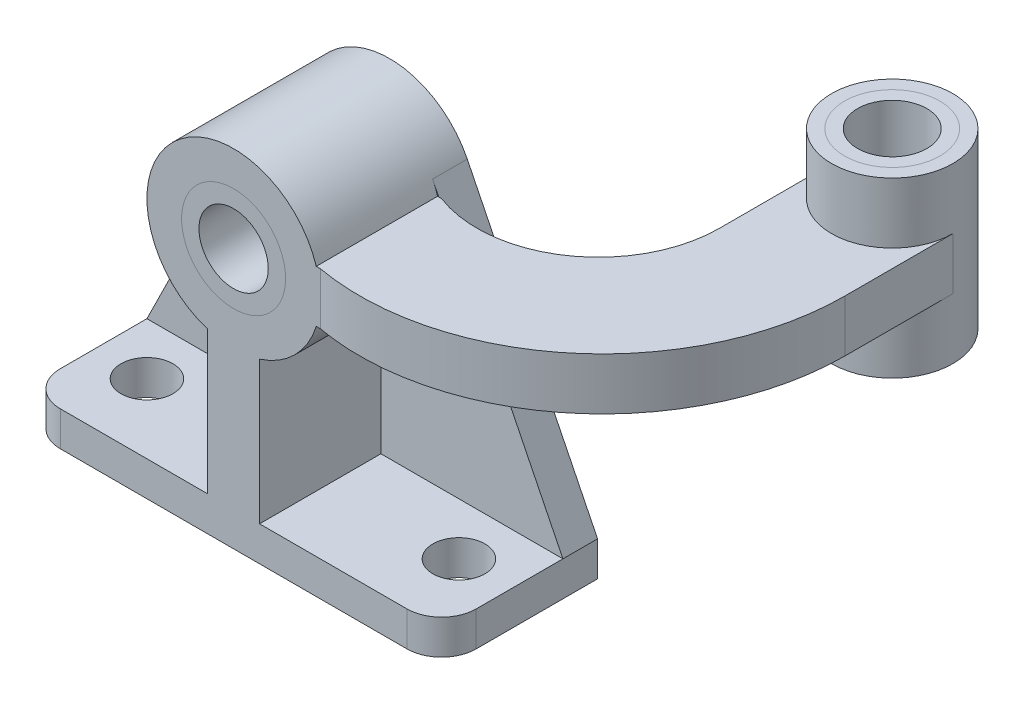
ISO-10303-21;
HEADER;
FILE_DESCRIPTION(('STEP AP214'),'2;1');
FILE_NAME('part.step','',(''),(''),'','','');
FILE_SCHEMA(('AUTOMOTIVE_DESIGN { 1 0 10303 214 1 1 1 1 }'));
ENDSEC;
DATA;
#1=APPLICATION_CONTEXT('core data for automotive mechanical design processes');
#2=APPLICATION_PROTOCOL_DEFINITION('international standard','automotive_design',2000,#1);
#3=PRODUCT_CONTEXT('',#1,'mechanical');
#4=PRODUCT('Part','Part','',(#3));
#5=PRODUCT_RELATED_PRODUCT_CATEGORY('part','',(#4));
#6=PRODUCT_DEFINITION_FORMATION('','',#4);
#7=PRODUCT_DEFINITION_CONTEXT('part definition',#1,'design');
#8=PRODUCT_DEFINITION('design','',#6,#7);
#9=PRODUCT_DEFINITION_SHAPE('','',#8);
#10=(LENGTH_UNIT() NAMED_UNIT(*) SI_UNIT(.MILLI.,.METRE.));
#11=(NAMED_UNIT(*) PLANE_ANGLE_UNIT() SI_UNIT($,.RADIAN.));
#12=(NAMED_UNIT(*) SI_UNIT($,.STERADIAN.) SOLID_ANGLE_UNIT());
#13=UNCERTAINTY_MEASURE_WITH_UNIT(LENGTH_MEASURE(1.E-05),#10,'distance_accuracy_value','');
#14=(GEOMETRIC_REPRESENTATION_CONTEXT(3) GLOBAL_UNCERTAINTY_ASSIGNED_CONTEXT((#13)) GLOBAL_UNIT_ASSIGNED_CONTEXT((#10,
#11,#12)) REPRESENTATION_CONTEXT('',''));
#15=CARTESIAN_POINT('',(0.,0.,0.));
#16=DIRECTION('',(0.,0.,1.));
#17=DIRECTION('',(1.,0.,0.));
#18=AXIS2_PLACEMENT_3D('',#15,#16,#17);
#19=CARTESIAN_POINT('',(18.,5.,-11.));
#20=DIRECTION('',(0.,-1.,0.));
#21=DIRECTION('',(0.,0.,-1.));
#22=AXIS2_PLACEMENT_3D('',#19,#20,#21);
#23=CYLINDRICAL_SURFACE('',#22,2.);
#24=CARTESIAN_POINT('',(18.,5.,-11.));
#25=DIRECTION('',(0.,1.,0.));
#26=DIRECTION('',(0.,0.,1.));
#27=AXIS2_PLACEMENT_3D('',#24,#25,#26);
#28=CIRCLE('',#27,2.);
#29=CARTESIAN_POINT('',(18.,5.,-9.));
#30=VERTEX_POINT('',#29);
#31=EDGE_CURVE('E61',#30,#30,#28,.T.);
#32=ORIENTED_EDGE('',*,*,#31,.T.);
#33=EDGE_LOOP('',(#32));
#34=FACE_BOUND('',#33,.T.);
#35=CARTESIAN_POINT('',(18.,-5.,-11.));
#36=DIRECTION('',(0.,1.,0.));
#37=DIRECTION('',(0.,0.,1.));
#38=AXIS2_PLACEMENT_3D('',#35,#36,#37);
#39=CIRCLE('',#38,2.);
#40=CARTESIAN_POINT('',(18.,-5.,-9.));
#41=VERTEX_POINT('',#40);
#42=EDGE_CURVE('E67',#41,#41,#39,.T.);
#43=ORIENTED_EDGE('',*,*,#42,.F.);
#44=EDGE_LOOP('',(#43));
#45=FACE_BOUND('',#44,.T.);
#46=ADVANCED_FACE('F54',(#34,#45),#23,.F.);
#47=CARTESIAN_POINT('',(18.,5.,-11.));
#48=DIRECTION('',(0.,-1.,0.));
#49=DIRECTION('',(0.,0.,-1.));
#50=AXIS2_PLACEMENT_3D('',#47,#48,#49);
#51=CYLINDRICAL_SURFACE('',#50,2.75);
#52=CARTESIAN_POINT('',(18.,5.,-11.));
#53=DIRECTION('',(0.,1.,0.));
#54=DIRECTION('',(0.,0.,1.));
#55=AXIS2_PLACEMENT_3D('',#52,#53,#54);
#56=CIRCLE('',#55,2.75);
#57=CARTESIAN_POINT('',(18.,5.,-8.25));
#58=VERTEX_POINT('',#57);
#59=EDGE_CURVE('E11',#58,#58,#56,.T.);
#60=ORIENTED_EDGE('',*,*,#59,.F.);
#61=EDGE_LOOP('',(#60));
#62=FACE_BOUND('',#61,.T.);
#63=CARTESIAN_POINT('',(18.,-5.,-11.));
#64=DIRECTION('',(0.,1.,0.));
#65=DIRECTION('',(0.,0.,1.));
#66=AXIS2_PLACEMENT_3D('',#63,#64,#65);
#67=CIRCLE('',#66,2.75);
#68=CARTESIAN_POINT('',(18.,-5.,-8.25));
#69=VERTEX_POINT('',#68);
#70=EDGE_CURVE('E57',#69,#69,#67,.T.);
#71=ORIENTED_EDGE('',*,*,#70,.T.);
#72=EDGE_LOOP('',(#71));
#73=FACE_BOUND('',#72,.T.);
#74=ADVANCED_FACE('F74',(#62,#73),#51,.T.);
#75=CARTESIAN_POINT('',(0.,5.,0.));
#76=DIRECTION('',(0.,1.,0.));
#77=DIRECTION('',(0.,0.,1.));
#78=AXIS2_PLACEMENT_3D('',#75,#76,#77);
#79=PLANE('',#78);
#80=ORIENTED_EDGE('',*,*,#31,.F.);
#81=EDGE_LOOP('',(#80));
#82=FACE_BOUND('',#81,.T.);
#83=ORIENTED_EDGE('',*,*,#59,.T.);
#84=EDGE_LOOP('',(#83));
#85=FACE_BOUND('',#84,.T.);
#86=ADVANCED_FACE('F78',(#82,#85),#79,.T.);
#87=CARTESIAN_POINT('',(0.,-5.,0.));
#88=DIRECTION('',(0.,1.,0.));
#89=DIRECTION('',(0.,0.,1.));
#90=AXIS2_PLACEMENT_3D('',#87,#88,#89);
#91=PLANE('',#90);
#92=ORIENTED_EDGE('',*,*,#42,.T.);
#93=EDGE_LOOP('',(#92));
#94=FACE_BOUND('',#93,.T.);
#95=ORIENTED_EDGE('',*,*,#70,.F.);
#96=EDGE_LOOP('',(#95));
#97=FACE_BOUND('',#96,.T.);
#98=ADVANCED_FACE('F76',(#94,#97),#91,.F.);
#99=CLOSED_SHELL('',(#46,#74,#86,#98));
#100=MANIFOLD_SOLID_BREP('B2',#99);
#101=CARTESIAN_POINT('',(0.,0.,9.));
#102=DIRECTION('',(0.,0.,-1.));
#103=DIRECTION('',(-1.,0.,0.));
#104=AXIS2_PLACEMENT_3D('',#101,#102,#103);
#105=CYLINDRICAL_SURFACE('',#104,2.);
#106=CARTESIAN_POINT('',(0.,0.,9.));
#107=DIRECTION('',(0.,0.,1.));
#108=DIRECTION('',(1.,0.,0.));
#109=AXIS2_PLACEMENT_3D('',#106,#107,#108);
#110=CIRCLE('',#109,2.);
#111=CARTESIAN_POINT('',(2.,0.,9.));
#112=VERTEX_POINT('',#111);
#113=EDGE_CURVE('E140',#112,#112,#110,.T.);
#114=ORIENTED_EDGE('',*,*,#113,.T.);
#115=EDGE_LOOP('',(#114));
#116=FACE_BOUND('',#115,.T.);
#117=CARTESIAN_POINT('',(0.,0.,0.));
#118=DIRECTION('',(0.,0.,1.));
#119=DIRECTION('',(1.,0.,0.));
#120=AXIS2_PLACEMENT_3D('',#117,#118,#119);
#121=CIRCLE('',#120,2.);
#122=CARTESIAN_POINT('',(2.,0.,0.));
#123=VERTEX_POINT('',#122);
#124=EDGE_CURVE('E146',#123,#123,#121,.T.);
#125=ORIENTED_EDGE('',*,*,#124,.F.);
#126=EDGE_LOOP('',(#125));
#127=FACE_BOUND('',#126,.T.);
#128=ADVANCED_FACE('F133',(#116,#127),#105,.F.);
#129=CARTESIAN_POINT('',(0.,0.,9.));
#130=DIRECTION('',(0.,0.,-1.));
#131=DIRECTION('',(-1.,0.,0.));
#132=AXIS2_PLACEMENT_3D('',#129,#130,#131);
#133=CYLINDRICAL_SURFACE('',#132,3.);
#134=CARTESIAN_POINT('',(0.,0.,9.));
#135=DIRECTION('',(0.,0.,1.));
#136=DIRECTION('',(1.,0.,0.));
#137=AXIS2_PLACEMENT_3D('',#134,#135,#136);
#138=CIRCLE('',#137,3.);
#139=CARTESIAN_POINT('',(3.,0.,9.));
#140=VERTEX_POINT('',#139);
#141=EDGE_CURVE('E53',#140,#140,#138,.T.);
#142=ORIENTED_EDGE('',*,*,#141,.F.);
#143=EDGE_LOOP('',(#142));
#144=FACE_BOUND('',#143,.T.);
#145=CARTESIAN_POINT('',(0.,0.,0.));
#146=DIRECTION('',(0.,0.,1.));
#147=DIRECTION('',(1.,0.,0.));
#148=AXIS2_PLACEMENT_3D('',#145,#146,#147);
#149=CIRCLE('',#148,3.);
#150=CARTESIAN_POINT('',(3.,0.,0.));
#151=VERTEX_POINT('',#150);
#152=EDGE_CURVE('E136',#151,#151,#149,.T.);
#153=ORIENTED_EDGE('',*,*,#152,.T.);
#154=EDGE_LOOP('',(#153));
#155=FACE_BOUND('',#154,.T.);
#156=ADVANCED_FACE('F153',(#144,#155),#133,.T.);
#157=CARTESIAN_POINT('',(0.,0.,9.));
#158=DIRECTION('',(0.,0.,1.));
#159=DIRECTION('',(1.,0.,0.));
#160=AXIS2_PLACEMENT_3D('',#157,#158,#159);
#161=PLANE('',#160);
#162=ORIENTED_EDGE('',*,*,#113,.F.);
#163=EDGE_LOOP('',(#162));
#164=FACE_BOUND('',#163,.T.);
#165=ORIENTED_EDGE('',*,*,#141,.T.);
#166=EDGE_LOOP('',(#165));
#167=FACE_BOUND('',#166,.T.);
#168=ADVANCED_FACE('F157',(#164,#167),#161,.T.);
#169=CARTESIAN_POINT('',(0.,0.,0.));
#170=DIRECTION('',(0.,0.,1.));
#171=DIRECTION('',(1.,0.,0.));
#172=AXIS2_PLACEMENT_3D('',#169,#170,#171);
#173=PLANE('',#172);
#174=ORIENTED_EDGE('',*,*,#124,.T.);
#175=EDGE_LOOP('',(#174));
#176=FACE_BOUND('',#175,.T.);
#177=ORIENTED_EDGE('',*,*,#152,.F.);
#178=EDGE_LOOP('',(#177));
#179=FACE_BOUND('',#178,.T.);
#180=ADVANCED_FACE('F155',(#176,#179),#173,.F.);
#181=CLOSED_SHELL('',(#128,#156,#168,#180));
#182=MANIFOLD_SOLID_BREP('B6',#181);
#183=CARTESIAN_POINT('',(0.,0.,9.));
#184=DIRECTION('',(0.,0.,-1.));
#185=DIRECTION('',(-1.,0.,0.));
#186=AXIS2_PLACEMENT_3D('',#183,#184,#185);
#187=CYLINDRICAL_SURFACE('',#186,5.);
#188=DIRECTION('',(0.,0.,-1.));
#189=VECTOR('',#188,1.);
#190=CARTESIAN_POINT('',(4.76969600708473,-1.5,9.));
#191=LINE('',#190,#189);
#192=CARTESIAN_POINT('',(4.76969600708473,-1.5,9.));
#193=VERTEX_POINT('',#192);
#194=CARTESIAN_POINT('',(4.76969600708473,-1.5,2.));
#195=VERTEX_POINT('',#194);
#196=EDGE_CURVE('E442',#193,#195,#191,.T.);
#197=ORIENTED_EDGE('',*,*,#196,.F.);
#198=CARTESIAN_POINT('',(0.,0.,9.));
#199=DIRECTION('',(0.,0.,1.));
#200=DIRECTION('',(1.,0.,0.));
#201=AXIS2_PLACEMENT_3D('',#198,#199,#200);
#202=CIRCLE('',#201,5.);
#203=CARTESIAN_POINT('',(1.5,-4.76969600708473,9.));
#204=VERTEX_POINT('',#203);
#205=EDGE_CURVE('E506',#204,#193,#202,.T.);
#206=ORIENTED_EDGE('',*,*,#205,.F.);
#207=DIRECTION('',(0.,0.,-1.));
#208=VECTOR('',#207,1.);
#209=CARTESIAN_POINT('',(1.5,-4.76969600708473,9.));
#210=LINE('',#209,#208);
#211=CARTESIAN_POINT('',(1.5,-4.76969600708473,2.));
#212=VERTEX_POINT('',#211);
#213=EDGE_CURVE('E558',#204,#212,#210,.T.);
#214=ORIENTED_EDGE('',*,*,#213,.T.);
#215=CARTESIAN_POINT('',(0.,0.,2.));
#216=DIRECTION('',(0.,0.,1.));
#217=DIRECTION('',(1.,0.,0.));
#218=AXIS2_PLACEMENT_3D('',#215,#216,#217);
#219=CIRCLE('',#218,5.);
#220=EDGE_CURVE('E567',#212,#195,#219,.T.);
#221=ORIENTED_EDGE('',*,*,#220,.T.);
#222=EDGE_LOOP('',(#197,#206,#214,#221));
#223=FACE_BOUND('',#222,.T.);
#224=ADVANCED_FACE('F209',(#223),#187,.T.);
#225=CARTESIAN_POINT('',(0.,0.,2.));
#226=DIRECTION('',(0.,0.,1.));
#227=DIRECTION('',(1.,0.,0.));
#228=AXIS2_PLACEMENT_3D('',#225,#226,#227);
#229=PLANE('',#228);
#230=DIRECTION('',(-0.442960872146089,0.896540944824929,0.));
#231=VECTOR('',#230,1.);
#232=CARTESIAN_POINT('',(4.48270472412465,2.21480436073044,2.));
#233=LINE('',#232,#231);
#234=CARTESIAN_POINT('',(12.,-13.,2.));
#235=VERTEX_POINT('',#234);
#236=CARTESIAN_POINT('',(5.,1.16781257308152,2.));
#237=VERTEX_POINT('',#236);
#238=EDGE_CURVE('E580',#235,#237,#233,.T.);
#239=ORIENTED_EDGE('',*,*,#238,.T.);
#240=DIRECTION('',(0.,-1.,0.));
#241=VECTOR('',#240,1.);
#242=CARTESIAN_POINT('',(5.,1.5,2.));
#243=LINE('',#242,#241);
#244=CARTESIAN_POINT('',(5.,-1.5,2.));
#245=VERTEX_POINT('',#244);
#246=EDGE_CURVE('E596',#237,#245,#243,.T.);
#247=ORIENTED_EDGE('',*,*,#246,.T.);
#248=DIRECTION('',(-1.,0.,0.));
#249=VECTOR('',#248,1.);
#250=CARTESIAN_POINT('',(0.,-1.5,2.));
#251=LINE('',#250,#249);
#252=EDGE_CURVE('E421',#245,#195,#251,.T.);
#253=ORIENTED_EDGE('',*,*,#252,.T.);
#254=ORIENTED_EDGE('',*,*,#220,.F.);
#255=DIRECTION('',(0.,-1.,0.));
#256=VECTOR('',#255,1.);
#257=CARTESIAN_POINT('',(1.5,0.,2.));
#258=LINE('',#257,#256);
#259=CARTESIAN_POINT('',(1.5,-13.,2.));
#260=VERTEX_POINT('',#259);
#261=EDGE_CURVE('E571',#212,#260,#258,.T.);
#262=ORIENTED_EDGE('',*,*,#261,.T.);
#263=DIRECTION('',(-1.,0.,0.));
#264=VECTOR('',#263,1.);
#265=CARTESIAN_POINT('',(0.,-13.,2.));
#266=LINE('',#265,#264);
#267=EDGE_CURVE('E576',#235,#260,#266,.T.);
#268=ORIENTED_EDGE('',*,*,#267,.F.);
#269=EDGE_LOOP('',(#239,#247,#253,#254,#262,#268));
#270=FACE_BOUND('',#269,.T.);
#271=ADVANCED_FACE('F688',(#270),#229,.T.);
#272=DIRECTION('',(-1.,0.,0.));
#273=VECTOR('',#272,1.);
#274=CARTESIAN_POINT('',(0.,1.5,2.));
#275=LINE('',#274,#273);
#276=CARTESIAN_POINT('',(4.83587360600412,1.5,2.));
#277=VERTEX_POINT('',#276);
#278=CARTESIAN_POINT('',(4.76969600708473,1.5,2.));
#279=VERTEX_POINT('',#278);
#280=EDGE_CURVE('E395',#277,#279,#275,.T.);
#281=ORIENTED_EDGE('',*,*,#280,.F.);
#282=CARTESIAN_POINT('',(4.48270472412465,2.21480436073044,2.));
#283=VERTEX_POINT('',#282);
#284=EDGE_CURVE('E579',#277,#283,#233,.T.);
#285=ORIENTED_EDGE('',*,*,#284,.T.);
#286=EDGE_CURVE('E572',#279,#283,#219,.T.);
#287=ORIENTED_EDGE('',*,*,#286,.F.);
#288=EDGE_LOOP('',(#281,#285,#287));
#289=FACE_BOUND('',#288,.T.);
#290=ADVANCED_FACE('F636',(#289),#229,.T.);
#291=CARTESIAN_POINT('',(4.76969600708473,1.5,9.));
#292=VERTEX_POINT('',#291);
#293=CARTESIAN_POINT('',(-1.5,-4.76969600708473,9.));
#294=VERTEX_POINT('',#293);
#295=EDGE_CURVE('E505',#292,#294,#202,.T.);
#296=ORIENTED_EDGE('',*,*,#295,.F.);
#297=DIRECTION('',(0.,0.,-1.));
#298=VECTOR('',#297,1.);
#299=CARTESIAN_POINT('',(4.76969600708473,1.5,9.));
#300=LINE('',#299,#298);
#301=EDGE_CURVE('E445',#292,#279,#300,.T.);
#302=ORIENTED_EDGE('',*,*,#301,.T.);
#303=ORIENTED_EDGE('',*,*,#286,.T.);
#304=DIRECTION('',(0.,0.,-1.));
#305=VECTOR('',#304,1.);
#306=CARTESIAN_POINT('',(4.48270472412465,2.21480436073044,2.));
#307=LINE('',#306,#305);
#308=CARTESIAN_POINT('',(4.48270472412465,2.21480436073044,0.));
#309=VERTEX_POINT('',#308);
#310=EDGE_CURVE('E584',#283,#309,#307,.T.);
#311=ORIENTED_EDGE('',*,*,#310,.T.);
#312=CARTESIAN_POINT('',(0.,0.,0.));
#313=DIRECTION('',(0.,0.,1.));
#314=DIRECTION('',(1.,0.,0.));
#315=AXIS2_PLACEMENT_3D('',#312,#313,#314);
#316=CIRCLE('',#315,5.);
#317=CARTESIAN_POINT('',(-4.48270472412464,2.21480436073044,0.));
#318=VERTEX_POINT('',#317);
#319=EDGE_CURVE('E525',#309,#318,#316,.T.);
#320=ORIENTED_EDGE('',*,*,#319,.T.);
#321=DIRECTION('',(0.,0.,-1.));
#322=VECTOR('',#321,1.);
#323=CARTESIAN_POINT('',(-4.48270472412464,2.21480436073044,2.));
#324=LINE('',#323,#322);
#325=CARTESIAN_POINT('',(-4.48270472412464,2.21480436073044,2.));
#326=VERTEX_POINT('',#325);
#327=EDGE_CURVE('E489',#326,#318,#324,.T.);
#328=ORIENTED_EDGE('',*,*,#327,.F.);
#329=CARTESIAN_POINT('',(0.,0.,2.));
#330=DIRECTION('',(0.,0.,1.));
#331=DIRECTION('',(1.,0.,0.));
#332=AXIS2_PLACEMENT_3D('',#329,#330,#331);
#333=CIRCLE('',#332,5.);
#334=CARTESIAN_POINT('',(-1.5,-4.76969600708473,2.));
#335=VERTEX_POINT('',#334);
#336=EDGE_CURVE('E466',#326,#335,#333,.T.);
#337=ORIENTED_EDGE('',*,*,#336,.T.);
#338=DIRECTION('',(0.,0.,-1.));
#339=VECTOR('',#338,1.);
#340=CARTESIAN_POINT('',(-1.5,-4.76969600708473,9.));
#341=LINE('',#340,#339);
#342=EDGE_CURVE('E554',#294,#335,#341,.T.);
#343=ORIENTED_EDGE('',*,*,#342,.F.);
#344=EDGE_LOOP('',(#296,#302,#303,#311,#320,#328,#337,#343));
#345=FACE_BOUND('',#344,.T.);
#346=ADVANCED_FACE('F633',(#345),#187,.T.);
#347=CARTESIAN_POINT('',(4.48270472412465,2.21480436073044,2.));
#348=DIRECTION('',(-0.896540944824929,-0.442960872146089,0.));
#349=DIRECTION('',(0.442960872146089,-0.896540944824929,0.));
#350=AXIS2_PLACEMENT_3D('',#347,#348,#349);
#351=PLANE('',#350);
#352=DIRECTION('',(-0.442960872146089,0.896540944824929,0.));
#353=VECTOR('',#352,1.);
#354=CARTESIAN_POINT('',(4.48270472412465,2.21480436073044,0.));
#355=LINE('',#354,#353);
#356=CARTESIAN_POINT('',(12.,-13.,0.));
#357=VERTEX_POINT('',#356);
#358=EDGE_CURVE('E566',#357,#309,#355,.T.);
#359=ORIENTED_EDGE('',*,*,#358,.T.);
#360=ORIENTED_EDGE('',*,*,#310,.F.);
#361=ORIENTED_EDGE('',*,*,#284,.F.);
#362=EDGE_CURVE('E585',#237,#277,#233,.T.);
#363=ORIENTED_EDGE('',*,*,#362,.F.);
#364=ORIENTED_EDGE('',*,*,#238,.F.);
#365=DIRECTION('',(0.,0.,-1.));
#366=VECTOR('',#365,1.);
#367=CARTESIAN_POINT('',(12.,-13.,2.));
#368=LINE('',#367,#366);
#369=EDGE_CURVE('E592',#235,#357,#368,.T.);
#370=ORIENTED_EDGE('',*,*,#369,.T.);
#371=EDGE_LOOP('',(#359,#360,#361,#363,#364,#370));
#372=FACE_BOUND('',#371,.T.);
#373=ADVANCED_FACE('F639',(#372),#351,.F.);
#374=CARTESIAN_POINT('',(0.,0.,0.));
#375=DIRECTION('',(0.,0.,1.));
#376=DIRECTION('',(1.,0.,0.));
#377=AXIS2_PLACEMENT_3D('',#374,#375,#376);
#378=PLANE('',#377);
#379=ORIENTED_EDGE('',*,*,#358,.F.);
#380=DIRECTION('',(0.,1.,0.));
#381=VECTOR('',#380,1.);
#382=CARTESIAN_POINT('',(12.,0.,0.));
#383=LINE('',#382,#381);
#384=CARTESIAN_POINT('',(12.,-15.,0.));
#385=VERTEX_POINT('',#384);
#386=EDGE_CURVE('E498',#385,#357,#383,.T.);
#387=ORIENTED_EDGE('',*,*,#386,.F.);
#388=DIRECTION('',(1.,0.,0.));
#389=VECTOR('',#388,1.);
#390=CARTESIAN_POINT('',(0.,-15.,0.));
#391=LINE('',#390,#389);
#392=CARTESIAN_POINT('',(-12.,-15.,0.));
#393=VERTEX_POINT('',#392);
#394=EDGE_CURVE('E533',#393,#385,#391,.T.);
#395=ORIENTED_EDGE('',*,*,#394,.F.);
#396=DIRECTION('',(0.,-1.,0.));
#397=VECTOR('',#396,1.);
#398=CARTESIAN_POINT('',(-12.,0.,0.));
#399=LINE('',#398,#397);
#400=CARTESIAN_POINT('',(-12.,-13.,0.));
#401=VERTEX_POINT('',#400);
#402=EDGE_CURVE('E529',#401,#393,#399,.T.);
#403=ORIENTED_EDGE('',*,*,#402,.F.);
#404=DIRECTION('',(0.442960872146088,0.896540944824929,0.));
#405=VECTOR('',#404,1.);
#406=CARTESIAN_POINT('',(-4.48270472412464,2.21480436073044,0.));
#407=LINE('',#406,#405);
#408=EDGE_CURVE('E459',#401,#318,#407,.T.);
#409=ORIENTED_EDGE('',*,*,#408,.T.);
#410=ORIENTED_EDGE('',*,*,#319,.F.);
#411=EDGE_LOOP('',(#379,#387,#395,#403,#409,#410));
#412=FACE_BOUND('',#411,.T.);
#413=CARTESIAN_POINT('',(0.,0.,0.));
#414=DIRECTION('',(0.,0.,1.));
#415=DIRECTION('',(1.,0.,0.));
#416=AXIS2_PLACEMENT_3D('',#413,#414,#415);
#417=CIRCLE('',#416,3.);
#418=CARTESIAN_POINT('',(3.,0.,0.));
#419=VERTEX_POINT('',#418);
#420=EDGE_CURVE('E492',#419,#419,#417,.T.);
#421=ORIENTED_EDGE('',*,*,#420,.T.);
#422=EDGE_LOOP('',(#421));
#423=FACE_BOUND('',#422,.T.);
#424=ADVANCED_FACE('F644',(#412,#423),#378,.F.);
#425=CARTESIAN_POINT('',(0.,-13.,9.));
#426=DIRECTION('',(0.,-1.,0.));
#427=DIRECTION('',(1.,0.,0.));
#428=AXIS2_PLACEMENT_3D('',#425,#426,#427);
#429=PLANE('',#428);
#430=CARTESIAN_POINT('',(9.,-13.,5.));
#431=DIRECTION('',(0.,1.,0.));
#432=DIRECTION('',(-1.,0.,0.));
#433=AXIS2_PLACEMENT_3D('',#430,#431,#432);
#434=CIRCLE('',#433,1.5);
#435=CARTESIAN_POINT('',(7.5,-13.,5.));
#436=VERTEX_POINT('',#435);
#437=EDGE_CURVE('E450',#436,#436,#434,.T.);
#438=ORIENTED_EDGE('',*,*,#437,.F.);
#439=EDGE_LOOP('',(#438));
#440=FACE_BOUND('',#439,.T.);
#441=DIRECTION('',(-1.,0.,0.));
#442=VECTOR('',#441,1.);
#443=CARTESIAN_POINT('',(0.,-13.,9.));
#444=LINE('',#443,#442);
#445=CARTESIAN_POINT('',(10.,-13.,9.));
#446=VERTEX_POINT('',#445);
#447=CARTESIAN_POINT('',(1.5,-13.,9.));
#448=VERTEX_POINT('',#447);
#449=EDGE_CURVE('E497',#446,#448,#444,.T.);
#450=ORIENTED_EDGE('',*,*,#449,.F.);
#451=CARTESIAN_POINT('',(10.,-13.,7.));
#452=DIRECTION('',(0.,-1.,0.));
#453=DIRECTION('',(1.,0.,0.));
#454=AXIS2_PLACEMENT_3D('',#451,#452,#453);
#455=CIRCLE('',#454,2.);
#456=CARTESIAN_POINT('',(12.,-13.,7.));
#457=VERTEX_POINT('',#456);
#458=EDGE_CURVE('E218',#446,#457,#455,.F.);
#459=ORIENTED_EDGE('',*,*,#458,.T.);
#460=DIRECTION('',(0.,0.,-1.));
#461=VECTOR('',#460,1.);
#462=CARTESIAN_POINT('',(12.,-13.,9.));
#463=LINE('',#462,#461);
#464=EDGE_CURVE('E521',#457,#235,#463,.T.);
#465=ORIENTED_EDGE('',*,*,#464,.T.);
#466=ORIENTED_EDGE('',*,*,#267,.T.);
#467=DIRECTION('',(0.,0.,-1.));
#468=VECTOR('',#467,1.);
#469=CARTESIAN_POINT('',(1.5,-13.,9.));
#470=LINE('',#469,#468);
#471=EDGE_CURVE('E562',#448,#260,#470,.T.);
#472=ORIENTED_EDGE('',*,*,#471,.F.);
#473=EDGE_LOOP('',(#450,#459,#465,#466,#472));
#474=FACE_BOUND('',#473,.T.);
#475=ADVANCED_FACE('F674',(#440,#474),#429,.F.);
#476=CARTESIAN_POINT('',(1.5,0.,9.));
#477=DIRECTION('',(1.,0.,0.));
#478=DIRECTION('',(0.,1.,0.));
#479=AXIS2_PLACEMENT_3D('',#476,#477,#478);
#480=PLANE('',#479);
#481=ORIENTED_EDGE('',*,*,#471,.T.);
#482=ORIENTED_EDGE('',*,*,#261,.F.);
#483=ORIENTED_EDGE('',*,*,#213,.F.);
#484=DIRECTION('',(0.,-1.,0.));
#485=VECTOR('',#484,1.);
#486=CARTESIAN_POINT('',(1.5,0.,9.));
#487=LINE('',#486,#485);
#488=EDGE_CURVE('E501',#204,#448,#487,.T.);
#489=ORIENTED_EDGE('',*,*,#488,.T.);
#490=EDGE_LOOP('',(#481,#482,#483,#489));
#491=FACE_BOUND('',#490,.T.);
#492=ADVANCED_FACE('F677',(#491),#480,.T.);
#493=CARTESIAN_POINT('',(-1.5,0.,9.));
#494=DIRECTION('',(1.,0.,0.));
#495=DIRECTION('',(0.,1.,0.));
#496=AXIS2_PLACEMENT_3D('',#493,#494,#495);
#497=PLANE('',#496);
#498=ORIENTED_EDGE('',*,*,#342,.T.);
#499=DIRECTION('',(0.,-1.,0.));
#500=VECTOR('',#499,1.);
#501=CARTESIAN_POINT('',(-1.5,0.,2.));
#502=LINE('',#501,#500);
#503=CARTESIAN_POINT('',(-1.5,-13.,2.));
#504=VERTEX_POINT('',#503);
#505=EDGE_CURVE('E478',#335,#504,#502,.T.);
#506=ORIENTED_EDGE('',*,*,#505,.T.);
#507=DIRECTION('',(0.,0.,-1.));
#508=VECTOR('',#507,1.);
#509=CARTESIAN_POINT('',(-1.5,-13.,9.));
#510=LINE('',#509,#508);
#511=CARTESIAN_POINT('',(-1.5,-13.,9.));
#512=VERTEX_POINT('',#511);
#513=EDGE_CURVE('E550',#512,#504,#510,.T.);
#514=ORIENTED_EDGE('',*,*,#513,.F.);
#515=DIRECTION('',(0.,-1.,0.));
#516=VECTOR('',#515,1.);
#517=CARTESIAN_POINT('',(-1.5,0.,9.));
#518=LINE('',#517,#516);
#519=EDGE_CURVE('E510',#294,#512,#518,.T.);
#520=ORIENTED_EDGE('',*,*,#519,.F.);
#521=EDGE_LOOP('',(#498,#506,#514,#520));
#522=FACE_BOUND('',#521,.T.);
#523=ADVANCED_FACE('F787',(#522),#497,.F.);
#524=CARTESIAN_POINT('',(0.,-13.,9.));
#525=DIRECTION('',(0.,-1.,0.));
#526=DIRECTION('',(1.,0.,0.));
#527=AXIS2_PLACEMENT_3D('',#524,#525,#526);
#528=PLANE('',#527);
#529=CARTESIAN_POINT('',(-9.,-13.,5.));
#530=DIRECTION('',(0.,1.,0.));
#531=DIRECTION('',(-1.,0.,0.));
#532=AXIS2_PLACEMENT_3D('',#529,#530,#531);
#533=CIRCLE('',#532,1.5);
#534=CARTESIAN_POINT('',(-10.5,-13.,5.));
#535=VERTEX_POINT('',#534);
#536=EDGE_CURVE('E455',#535,#535,#533,.T.);
#537=ORIENTED_EDGE('',*,*,#536,.F.);
#538=EDGE_LOOP('',(#537));
#539=FACE_BOUND('',#538,.T.);
#540=DIRECTION('',(0.,0.,-1.));
#541=VECTOR('',#540,1.);
#542=CARTESIAN_POINT('',(-12.,-13.,9.));
#543=LINE('',#542,#541);
#544=CARTESIAN_POINT('',(-12.,-13.,7.));
#545=VERTEX_POINT('',#544);
#546=CARTESIAN_POINT('',(-12.,-13.,2.));
#547=VERTEX_POINT('',#546);
#548=EDGE_CURVE('E547',#545,#547,#543,.T.);
#549=ORIENTED_EDGE('',*,*,#548,.F.);
#550=CARTESIAN_POINT('',(-9.99999999999999,-13.,7.));
#551=DIRECTION('',(0.,-1.,0.));
#552=DIRECTION('',(1.,0.,0.));
#553=AXIS2_PLACEMENT_3D('',#550,#551,#552);
#554=CIRCLE('',#553,2.);
#555=CARTESIAN_POINT('',(-9.99999999999999,-13.,9.));
#556=VERTEX_POINT('',#555);
#557=EDGE_CURVE('E616',#545,#556,#554,.F.);
#558=ORIENTED_EDGE('',*,*,#557,.T.);
#559=DIRECTION('',(-1.,0.,0.));
#560=VECTOR('',#559,1.);
#561=CARTESIAN_POINT('',(0.,-13.,9.));
#562=LINE('',#561,#560);
#563=EDGE_CURVE('E513',#512,#556,#562,.T.);
#564=ORIENTED_EDGE('',*,*,#563,.F.);
#565=ORIENTED_EDGE('',*,*,#513,.T.);
#566=DIRECTION('',(-1.,0.,0.));
#567=VECTOR('',#566,1.);
#568=CARTESIAN_POINT('',(0.,-13.,2.));
#569=LINE('',#568,#567);
#570=EDGE_CURVE('E474',#504,#547,#569,.T.);
#571=ORIENTED_EDGE('',*,*,#570,.T.);
#572=EDGE_LOOP('',(#549,#558,#564,#565,#571));
#573=FACE_BOUND('',#572,.T.);
#574=ADVANCED_FACE('F656',(#539,#573),#528,.F.);
#575=CARTESIAN_POINT('',(-12.,0.,9.));
#576=DIRECTION('',(1.,0.,0.));
#577=DIRECTION('',(0.,1.,0.));
#578=AXIS2_PLACEMENT_3D('',#575,#576,#577);
#579=PLANE('',#578);
#580=DIRECTION('',(0.,0.,-1.));
#581=VECTOR('',#580,1.);
#582=CARTESIAN_POINT('',(-12.,-15.,9.));
#583=LINE('',#582,#581);
#584=CARTESIAN_POINT('',(-12.,-15.,7.));
#585=VERTEX_POINT('',#584);
#586=EDGE_CURVE('E544',#585,#393,#583,.T.);
#587=ORIENTED_EDGE('',*,*,#586,.F.);
#588=DIRECTION('',(0.,-1.,0.));
#589=VECTOR('',#588,1.);
#590=CARTESIAN_POINT('',(-12.,-13.,7.));
#591=LINE('',#590,#589);
#592=EDGE_CURVE('E232',#585,#545,#591,.F.);
#593=ORIENTED_EDGE('',*,*,#592,.T.);
#594=ORIENTED_EDGE('',*,*,#548,.T.);
#595=DIRECTION('',(0.,0.,-1.));
#596=VECTOR('',#595,1.);
#597=CARTESIAN_POINT('',(-12.,-13.,2.));
#598=LINE('',#597,#596);
#599=EDGE_CURVE('E482',#547,#401,#598,.T.);
#600=ORIENTED_EDGE('',*,*,#599,.T.);
#601=ORIENTED_EDGE('',*,*,#402,.T.);
#602=EDGE_LOOP('',(#587,#593,#594,#600,#601));
#603=FACE_BOUND('',#602,.T.);
#604=ADVANCED_FACE('F653',(#603),#579,.F.);
#605=CARTESIAN_POINT('',(0.,-15.,9.));
#606=DIRECTION('',(0.,1.,0.));
#607=DIRECTION('',(-1.,0.,0.));
#608=AXIS2_PLACEMENT_3D('',#605,#606,#607);
#609=PLANE('',#608);
#610=CARTESIAN_POINT('',(9.,-15.,5.));
#611=DIRECTION('',(0.,1.,0.));
#612=DIRECTION('',(-1.,0.,0.));
#613=AXIS2_PLACEMENT_3D('',#610,#611,#612);
#614=CIRCLE('',#613,1.5);
#615=CARTESIAN_POINT('',(7.5,-15.,5.));
#616=VERTEX_POINT('',#615);
#617=EDGE_CURVE('E454',#616,#616,#614,.F.);
#618=ORIENTED_EDGE('',*,*,#617,.F.);
#619=EDGE_LOOP('',(#618));
#620=FACE_BOUND('',#619,.T.);
#621=CARTESIAN_POINT('',(-9.,-15.,5.));
#622=DIRECTION('',(0.,1.,0.));
#623=DIRECTION('',(-1.,0.,0.));
#624=AXIS2_PLACEMENT_3D('',#621,#622,#623);
#625=CIRCLE('',#624,1.5);
#626=CARTESIAN_POINT('',(-10.5,-15.,5.));
#627=VERTEX_POINT('',#626);
#628=EDGE_CURVE('E449',#627,#627,#625,.F.);
#629=ORIENTED_EDGE('',*,*,#628,.F.);
#630=EDGE_LOOP('',(#629));
#631=FACE_BOUND('',#630,.T.);
#632=DIRECTION('',(1.,0.,0.));
#633=VECTOR('',#632,1.);
#634=CARTESIAN_POINT('',(0.,-15.,9.));
#635=LINE('',#634,#633);
#636=CARTESIAN_POINT('',(-10.,-15.,9.));
#637=VERTEX_POINT('',#636);
#638=CARTESIAN_POINT('',(10.,-15.,9.));
#639=VERTEX_POINT('',#638);
#640=EDGE_CURVE('E517',#637,#639,#635,.T.);
#641=ORIENTED_EDGE('',*,*,#640,.F.);
#642=CARTESIAN_POINT('',(-10.,-15.,7.));
#643=DIRECTION('',(0.,1.,0.));
#644=DIRECTION('',(-1.,0.,0.));
#645=AXIS2_PLACEMENT_3D('',#642,#643,#644);
#646=CIRCLE('',#645,2.);
#647=EDGE_CURVE('E611',#637,#585,#646,.F.);
#648=ORIENTED_EDGE('',*,*,#647,.T.);
#649=ORIENTED_EDGE('',*,*,#586,.T.);
#650=ORIENTED_EDGE('',*,*,#394,.T.);
#651=DIRECTION('',(0.,0.,-1.));
#652=VECTOR('',#651,1.);
#653=CARTESIAN_POINT('',(12.,-15.,9.));
#654=LINE('',#653,#652);
#655=CARTESIAN_POINT('',(12.,-15.,7.));
#656=VERTEX_POINT('',#655);
#657=EDGE_CURVE('E541',#656,#385,#654,.T.);
#658=ORIENTED_EDGE('',*,*,#657,.F.);
#659=CARTESIAN_POINT('',(10.,-15.,7.));
#660=DIRECTION('',(0.,1.,0.));
#661=DIRECTION('',(-1.,0.,0.));
#662=AXIS2_PLACEMENT_3D('',#659,#660,#661);
#663=CIRCLE('',#662,2.);
#664=EDGE_CURVE('E608',#656,#639,#663,.F.);
#665=ORIENTED_EDGE('',*,*,#664,.T.);
#666=EDGE_LOOP('',(#641,#648,#649,#650,#658,#665));
#667=FACE_BOUND('',#666,.T.);
#668=ADVANCED_FACE('F667',(#620,#631,#667),#609,.F.);
#669=CARTESIAN_POINT('',(0.,0.,9.));
#670=DIRECTION('',(0.,0.,-1.));
#671=DIRECTION('',(-1.,0.,0.));
#672=AXIS2_PLACEMENT_3D('',#669,#670,#671);
#673=CYLINDRICAL_SURFACE('',#672,3.);
#674=CARTESIAN_POINT('',(0.,0.,9.));
#675=DIRECTION('',(0.,0.,1.));
#676=DIRECTION('',(1.,0.,0.));
#677=AXIS2_PLACEMENT_3D('',#674,#675,#676);
#678=CIRCLE('',#677,3.);
#679=CARTESIAN_POINT('',(3.,0.,9.));
#680=VERTEX_POINT('',#679);
#681=EDGE_CURVE('E493',#680,#680,#678,.T.);
#682=ORIENTED_EDGE('',*,*,#681,.T.);
#683=EDGE_LOOP('',(#682));
#684=FACE_BOUND('',#683,.T.);
#685=ORIENTED_EDGE('',*,*,#420,.F.);
#686=EDGE_LOOP('',(#685));
#687=FACE_BOUND('',#686,.T.);
#688=ADVANCED_FACE('F725',(#684,#687),#673,.F.);
#689=CARTESIAN_POINT('',(12.,0.,9.));
#690=DIRECTION('',(-1.,0.,0.));
#691=DIRECTION('',(0.,-1.,0.));
#692=AXIS2_PLACEMENT_3D('',#689,#690,#691);
#693=PLANE('',#692);
#694=ORIENTED_EDGE('',*,*,#464,.F.);
#695=DIRECTION('',(0.,1.,0.));
#696=VECTOR('',#695,1.);
#697=CARTESIAN_POINT('',(12.,-15.,7.));
#698=LINE('',#697,#696);
#699=EDGE_CURVE('E131',#457,#656,#698,.F.);
#700=ORIENTED_EDGE('',*,*,#699,.T.);
#701=ORIENTED_EDGE('',*,*,#657,.T.);
#702=ORIENTED_EDGE('',*,*,#386,.T.);
#703=ORIENTED_EDGE('',*,*,#369,.F.);
#704=EDGE_LOOP('',(#694,#700,#701,#702,#703));
#705=FACE_BOUND('',#704,.T.);
#706=ADVANCED_FACE('F777',(#705),#693,.F.);
#707=CARTESIAN_POINT('',(0.,0.,9.));
#708=DIRECTION('',(0.,0.,1.));
#709=DIRECTION('',(1.,0.,0.));
#710=AXIS2_PLACEMENT_3D('',#707,#708,#709);
#711=PLANE('',#710);
#712=ORIENTED_EDGE('',*,*,#563,.T.);
#713=DIRECTION('',(0.,-1.,0.));
#714=VECTOR('',#713,1.);
#715=CARTESIAN_POINT('',(-10.,-15.,9.));
#716=LINE('',#715,#714);
#717=EDGE_CURVE('E604',#556,#637,#716,.T.);
#718=ORIENTED_EDGE('',*,*,#717,.T.);
#719=ORIENTED_EDGE('',*,*,#640,.T.);
#720=DIRECTION('',(0.,1.,0.));
#721=VECTOR('',#720,1.);
#722=CARTESIAN_POINT('',(10.,-13.,9.));
#723=LINE('',#722,#721);
#724=EDGE_CURVE('E600',#639,#446,#723,.T.);
#725=ORIENTED_EDGE('',*,*,#724,.T.);
#726=ORIENTED_EDGE('',*,*,#449,.T.);
#727=ORIENTED_EDGE('',*,*,#488,.F.);
#728=ORIENTED_EDGE('',*,*,#205,.T.);
#729=DIRECTION('',(1.,0.,0.));
#730=VECTOR('',#729,1.);
#731=CARTESIAN_POINT('',(0.,-1.5,9.));
#732=LINE('',#731,#730);
#733=CARTESIAN_POINT('',(5.,-1.5,9.));
#734=VERTEX_POINT('',#733);
#735=EDGE_CURVE('E425',#193,#734,#732,.T.);
#736=ORIENTED_EDGE('',*,*,#735,.T.);
#737=DIRECTION('',(0.,-1.,0.));
#738=VECTOR('',#737,1.);
#739=CARTESIAN_POINT('',(5.,1.5,9.));
#740=LINE('',#739,#738);
#741=CARTESIAN_POINT('',(5.,1.5,9.));
#742=VERTEX_POINT('',#741);
#743=EDGE_CURVE('E403',#742,#734,#740,.T.);
#744=ORIENTED_EDGE('',*,*,#743,.F.);
#745=DIRECTION('',(1.,0.,0.));
#746=VECTOR('',#745,1.);
#747=CARTESIAN_POINT('',(0.,1.5,9.));
#748=LINE('',#747,#746);
#749=EDGE_CURVE('E400',#292,#742,#748,.T.);
#750=ORIENTED_EDGE('',*,*,#749,.F.);
#751=ORIENTED_EDGE('',*,*,#295,.T.);
#752=ORIENTED_EDGE('',*,*,#519,.T.);
#753=EDGE_LOOP('',(#712,#718,#719,#725,#726,#727,#728,#736,#744,#750,#751,#752));
#754=FACE_BOUND('',#753,.T.);
#755=ORIENTED_EDGE('',*,*,#681,.F.);
#756=EDGE_LOOP('',(#755));
#757=FACE_BOUND('',#756,.T.);
#758=ADVANCED_FACE('F663',(#754,#757),#711,.T.);
#759=CARTESIAN_POINT('',(-4.48270472412464,2.21480436073044,2.));
#760=DIRECTION('',(-0.896540944824929,0.442960872146088,0.));
#761=DIRECTION('',(-0.442960872146088,-0.896540944824929,0.));
#762=AXIS2_PLACEMENT_3D('',#759,#760,#761);
#763=PLANE('',#762);
#764=ORIENTED_EDGE('',*,*,#408,.F.);
#765=ORIENTED_EDGE('',*,*,#599,.F.);
#766=DIRECTION('',(0.442960872146088,0.896540944824929,0.));
#767=VECTOR('',#766,1.);
#768=CARTESIAN_POINT('',(-4.48270472412464,2.21480436073044,2.));
#769=LINE('',#768,#767);
#770=EDGE_CURVE('E470',#547,#326,#769,.T.);
#771=ORIENTED_EDGE('',*,*,#770,.T.);
#772=ORIENTED_EDGE('',*,*,#327,.T.);
#773=EDGE_LOOP('',(#764,#765,#771,#772));
#774=FACE_BOUND('',#773,.T.);
#775=ADVANCED_FACE('F651',(#774),#763,.T.);
#776=CARTESIAN_POINT('',(0.,0.,2.));
#777=DIRECTION('',(0.,0.,1.));
#778=DIRECTION('',(1.,0.,0.));
#779=AXIS2_PLACEMENT_3D('',#776,#777,#778);
#780=PLANE('',#779);
#781=ORIENTED_EDGE('',*,*,#336,.F.);
#782=ORIENTED_EDGE('',*,*,#770,.F.);
#783=ORIENTED_EDGE('',*,*,#570,.F.);
#784=ORIENTED_EDGE('',*,*,#505,.F.);
#785=EDGE_LOOP('',(#781,#782,#783,#784));
#786=FACE_BOUND('',#785,.T.);
#787=ADVANCED_FACE('F768',(#786),#780,.T.);
#788=CARTESIAN_POINT('',(-9.,-15.001,5.));
#789=DIRECTION('',(0.,1.,0.));
#790=DIRECTION('',(-1.,0.,0.));
#791=AXIS2_PLACEMENT_3D('',#788,#789,#790);
#792=CYLINDRICAL_SURFACE('',#791,1.5);
#793=ORIENTED_EDGE('',*,*,#536,.T.);
#794=EDGE_LOOP('',(#793));
#795=FACE_BOUND('',#794,.T.);
#796=ORIENTED_EDGE('',*,*,#628,.T.);
#797=EDGE_LOOP('',(#796));
#798=FACE_BOUND('',#797,.T.);
#799=ADVANCED_FACE('F702',(#795,#798),#792,.F.);
#800=CARTESIAN_POINT('',(9.,-15.001,5.));
#801=DIRECTION('',(0.,1.,0.));
#802=DIRECTION('',(-1.,0.,0.));
#803=AXIS2_PLACEMENT_3D('',#800,#801,#802);
#804=CYLINDRICAL_SURFACE('',#803,1.5);
#805=ORIENTED_EDGE('',*,*,#437,.T.);
#806=EDGE_LOOP('',(#805));
#807=FACE_BOUND('',#806,.T.);
#808=ORIENTED_EDGE('',*,*,#617,.T.);
#809=EDGE_LOOP('',(#808));
#810=FACE_BOUND('',#809,.T.);
#811=ADVANCED_FACE('F695',(#807,#810),#804,.F.);
#812=CARTESIAN_POINT('',(0.,1.5,2.));
#813=DIRECTION('',(0.,0.,1.));
#814=DIRECTION('',(1.,0.,0.));
#815=AXIS2_PLACEMENT_3D('',#812,#813,#814);
#816=PLANE('',#815);
#817=DIRECTION('',(0.,-1.,0.));
#818=VECTOR('',#817,1.);
#819=CARTESIAN_POINT('',(5.,1.5,2.));
#820=LINE('',#819,#818);
#821=CARTESIAN_POINT('',(5.,1.5,2.));
#822=VERTEX_POINT('',#821);
#823=EDGE_CURVE('E431',#822,#237,#820,.T.);
#824=ORIENTED_EDGE('',*,*,#823,.T.);
#825=ORIENTED_EDGE('',*,*,#362,.T.);
#826=EDGE_CURVE('E396',#822,#277,#275,.T.);
#827=ORIENTED_EDGE('',*,*,#826,.F.);
#828=EDGE_LOOP('',(#824,#825,#827));
#829=FACE_BOUND('',#828,.T.);
#830=ADVANCED_FACE('F693',(#829),#816,.F.);
#831=CARTESIAN_POINT('',(0.,1.5,0.));
#832=DIRECTION('',(0.,1.,0.));
#833=DIRECTION('',(0.,0.,1.));
#834=AXIS2_PLACEMENT_3D('',#831,#832,#833);
#835=PLANE('',#834);
#836=ORIENTED_EDGE('',*,*,#301,.F.);
#837=ORIENTED_EDGE('',*,*,#749,.T.);
#838=CARTESIAN_POINT('',(7.5,1.5,-4.77497731395591));
#839=DIRECTION('',(0.,1.,0.));
#840=DIRECTION('',(0.,0.,1.));
#841=AXIS2_PLACEMENT_3D('',#838,#839,#840);
#842=CIRCLE('',#841,14.);
#843=CARTESIAN_POINT('',(21.5,1.5,-4.77497731395591));
#844=VERTEX_POINT('',#843);
#845=EDGE_CURVE('E389',#844,#742,#842,.F.);
#846=ORIENTED_EDGE('',*,*,#845,.F.);
#847=DIRECTION('',(0.,0.,1.));
#848=VECTOR('',#847,1.);
#849=CARTESIAN_POINT('',(21.5,1.5,0.));
#850=LINE('',#849,#848);
#851=CARTESIAN_POINT('',(21.5,1.5,-11.));
#852=VERTEX_POINT('',#851);
#853=EDGE_CURVE('E385',#852,#844,#850,.T.);
#854=ORIENTED_EDGE('',*,*,#853,.F.);
#855=CARTESIAN_POINT('',(18.,1.5,-11.));
#856=DIRECTION('',(0.,1.,0.));
#857=DIRECTION('',(0.,0.,1.));
#858=AXIS2_PLACEMENT_3D('',#855,#856,#857);
#859=CIRCLE('',#858,3.5);
#860=CARTESIAN_POINT('',(14.5,1.5,-11.));
#861=VERTEX_POINT('',#860);
#862=EDGE_CURVE('E362',#861,#852,#859,.T.);
#863=ORIENTED_EDGE('',*,*,#862,.F.);
#864=DIRECTION('',(0.,0.,1.));
#865=VECTOR('',#864,1.);
#866=CARTESIAN_POINT('',(14.5,1.5,0.));
#867=LINE('',#866,#865);
#868=CARTESIAN_POINT('',(14.5,1.5,-4.53834841531101));
#869=VERTEX_POINT('',#868);
#870=EDGE_CURVE('E373',#861,#869,#867,.T.);
#871=ORIENTED_EDGE('',*,*,#870,.T.);
#872=CARTESIAN_POINT('',(7.5,1.5,-4.53834841531101));
#873=DIRECTION('',(0.,1.,0.));
#874=DIRECTION('',(0.,0.,1.));
#875=AXIS2_PLACEMENT_3D('',#872,#873,#874);
#876=CIRCLE('',#875,7.);
#877=EDGE_CURVE('E379',#869,#822,#876,.F.);
#878=ORIENTED_EDGE('',*,*,#877,.T.);
#879=ORIENTED_EDGE('',*,*,#826,.T.);
#880=ORIENTED_EDGE('',*,*,#280,.T.);
#881=EDGE_LOOP('',(#836,#837,#846,#854,#863,#871,#878,#879,#880));
#882=FACE_BOUND('',#881,.T.);
#883=ADVANCED_FACE('F382',(#882),#835,.T.);
#884=CARTESIAN_POINT('',(0.,-1.5,0.));
#885=DIRECTION('',(0.,1.,0.));
#886=DIRECTION('',(0.,0.,1.));
#887=AXIS2_PLACEMENT_3D('',#884,#885,#886);
#888=PLANE('',#887);
#889=ORIENTED_EDGE('',*,*,#735,.F.);
#890=ORIENTED_EDGE('',*,*,#196,.T.);
#891=ORIENTED_EDGE('',*,*,#252,.F.);
#892=CARTESIAN_POINT('',(7.5,-1.5,-4.53834841531101));
#893=DIRECTION('',(0.,1.,0.));
#894=DIRECTION('',(0.,0.,1.));
#895=AXIS2_PLACEMENT_3D('',#892,#893,#894);
#896=CIRCLE('',#895,7.);
#897=CARTESIAN_POINT('',(14.5,-1.5,-4.53834841531101));
#898=VERTEX_POINT('',#897);
#899=EDGE_CURVE('E418',#898,#245,#896,.F.);
#900=ORIENTED_EDGE('',*,*,#899,.F.);
#901=DIRECTION('',(0.,0.,1.));
#902=VECTOR('',#901,1.);
#903=CARTESIAN_POINT('',(14.5,-1.5,0.));
#904=LINE('',#903,#902);
#905=CARTESIAN_POINT('',(14.5,-1.5,-11.));
#906=VERTEX_POINT('',#905);
#907=EDGE_CURVE('E415',#906,#898,#904,.T.);
#908=ORIENTED_EDGE('',*,*,#907,.F.);
#909=CARTESIAN_POINT('',(18.,-1.5,-11.));
#910=DIRECTION('',(0.,1.,0.));
#911=DIRECTION('',(0.,0.,1.));
#912=AXIS2_PLACEMENT_3D('',#909,#910,#911);
#913=CIRCLE('',#912,3.5);
#914=CARTESIAN_POINT('',(21.5,-1.5,-11.));
#915=VERTEX_POINT('',#914);
#916=EDGE_CURVE('E365',#906,#915,#913,.T.);
#917=ORIENTED_EDGE('',*,*,#916,.T.);
#918=DIRECTION('',(0.,0.,1.));
#919=VECTOR('',#918,1.);
#920=CARTESIAN_POINT('',(21.5,-1.5,0.));
#921=LINE('',#920,#919);
#922=CARTESIAN_POINT('',(21.5,-1.5,-4.77497731395591));
#923=VERTEX_POINT('',#922);
#924=EDGE_CURVE('E408',#915,#923,#921,.T.);
#925=ORIENTED_EDGE('',*,*,#924,.T.);
#926=CARTESIAN_POINT('',(7.5,-1.5,-4.77497731395591));
#927=DIRECTION('',(0.,1.,0.));
#928=DIRECTION('',(0.,0.,1.));
#929=AXIS2_PLACEMENT_3D('',#926,#927,#928);
#930=CIRCLE('',#929,14.);
#931=EDGE_CURVE('E404',#923,#734,#930,.F.);
#932=ORIENTED_EDGE('',*,*,#931,.T.);
#933=EDGE_LOOP('',(#889,#890,#891,#900,#908,#917,#925,#932));
#934=FACE_BOUND('',#933,.T.);
#935=ADVANCED_FACE('F685',(#934),#888,.F.);
#936=CARTESIAN_POINT('',(7.5,1.5,-4.77497731395591));
#937=DIRECTION('',(0.,-1.,0.));
#938=DIRECTION('',(0.,0.,-1.));
#939=AXIS2_PLACEMENT_3D('',#936,#937,#938);
#940=CYLINDRICAL_SURFACE('',#939,14.);
#941=ORIENTED_EDGE('',*,*,#931,.F.);
#942=DIRECTION('',(0.,-1.,0.));
#943=VECTOR('',#942,1.);
#944=CARTESIAN_POINT('',(21.5,1.5,-4.77497731395591));
#945=LINE('',#944,#943);
#946=EDGE_CURVE('E439',#844,#923,#945,.T.);
#947=ORIENTED_EDGE('',*,*,#946,.F.);
#948=ORIENTED_EDGE('',*,*,#845,.T.);
#949=ORIENTED_EDGE('',*,*,#743,.T.);
#950=EDGE_LOOP('',(#941,#947,#948,#949));
#951=FACE_BOUND('',#950,.T.);
#952=ADVANCED_FACE('F751',(#951),#940,.T.);
#953=CARTESIAN_POINT('',(21.5,1.5,0.));
#954=DIRECTION('',(1.,0.,0.));
#955=DIRECTION('',(0.,0.,-1.));
#956=AXIS2_PLACEMENT_3D('',#953,#954,#955);
#957=PLANE('',#956);
#958=ORIENTED_EDGE('',*,*,#924,.F.);
#959=DIRECTION('',(0.,-1.,0.));
#960=VECTOR('',#959,1.);
#961=CARTESIAN_POINT('',(21.5,1.5,-11.));
#962=LINE('',#961,#960);
#963=EDGE_CURVE('E369',#852,#915,#962,.T.);
#964=ORIENTED_EDGE('',*,*,#963,.F.);
#965=ORIENTED_EDGE('',*,*,#853,.T.);
#966=ORIENTED_EDGE('',*,*,#946,.T.);
#967=EDGE_LOOP('',(#958,#964,#965,#966));
#968=FACE_BOUND('',#967,.T.);
#969=ADVANCED_FACE('F755',(#968),#957,.T.);
#970=CARTESIAN_POINT('',(14.5,1.5,0.));
#971=DIRECTION('',(1.,0.,0.));
#972=DIRECTION('',(0.,0.,-1.));
#973=AXIS2_PLACEMENT_3D('',#970,#971,#972);
#974=PLANE('',#973);
#975=ORIENTED_EDGE('',*,*,#907,.T.);
#976=DIRECTION('',(0.,-1.,0.));
#977=VECTOR('',#976,1.);
#978=CARTESIAN_POINT('',(14.5,1.5,-4.53834841531101));
#979=LINE('',#978,#977);
#980=EDGE_CURVE('E370',#869,#898,#979,.T.);
#981=ORIENTED_EDGE('',*,*,#980,.F.);
#982=ORIENTED_EDGE('',*,*,#870,.F.);
#983=DIRECTION('',(0.,-1.,0.));
#984=VECTOR('',#983,1.);
#985=CARTESIAN_POINT('',(14.5,1.5,-11.));
#986=LINE('',#985,#984);
#987=EDGE_CURVE('E357',#861,#906,#986,.T.);
#988=ORIENTED_EDGE('',*,*,#987,.T.);
#989=EDGE_LOOP('',(#975,#981,#982,#988));
#990=FACE_BOUND('',#989,.T.);
#991=ADVANCED_FACE('F374',(#990),#974,.F.);
#992=CARTESIAN_POINT('',(7.5,1.5,-4.53834841531101));
#993=DIRECTION('',(0.,-1.,0.));
#994=DIRECTION('',(0.,0.,-1.));
#995=AXIS2_PLACEMENT_3D('',#992,#993,#994);
#996=CYLINDRICAL_SURFACE('',#995,7.);
#997=ORIENTED_EDGE('',*,*,#899,.T.);
#998=ORIENTED_EDGE('',*,*,#246,.F.);
#999=ORIENTED_EDGE('',*,*,#823,.F.);
#1000=ORIENTED_EDGE('',*,*,#877,.F.);
#1001=ORIENTED_EDGE('',*,*,#980,.T.);
#1002=EDGE_LOOP('',(#997,#998,#999,#1000,#1001));
#1003=FACE_BOUND('',#1002,.T.);
#1004=ADVANCED_FACE('F691',(#1003),#996,.F.);
#1005=CARTESIAN_POINT('',(18.,5.,-11.));
#1006=DIRECTION('',(0.,-1.,0.));
#1007=DIRECTION('',(0.,0.,-1.));
#1008=AXIS2_PLACEMENT_3D('',#1005,#1006,#1007);
#1009=CYLINDRICAL_SURFACE('',#1008,2.75);
#1010=CARTESIAN_POINT('',(18.,5.,-11.));
#1011=DIRECTION('',(0.,1.,0.));
#1012=DIRECTION('',(0.,0.,1.));
#1013=AXIS2_PLACEMENT_3D('',#1010,#1011,#1012);
#1014=CIRCLE('',#1013,2.75);
#1015=CARTESIAN_POINT('',(18.,5.,-8.25));
#1016=VERTEX_POINT('',#1015);
#1017=EDGE_CURVE('E804',#1016,#1016,#1014,.T.);
#1018=ORIENTED_EDGE('',*,*,#1017,.T.);
#1019=EDGE_LOOP('',(#1018));
#1020=FACE_BOUND('',#1019,.T.);
#1021=CARTESIAN_POINT('',(18.,-5.,-11.));
#1022=DIRECTION('',(0.,1.,0.));
#1023=DIRECTION('',(0.,0.,1.));
#1024=AXIS2_PLACEMENT_3D('',#1021,#1022,#1023);
#1025=CIRCLE('',#1024,2.75);
#1026=CARTESIAN_POINT('',(18.,-5.,-8.25));
#1027=VERTEX_POINT('',#1026);
#1028=EDGE_CURVE('E805',#1027,#1027,#1025,.T.);
#1029=ORIENTED_EDGE('',*,*,#1028,.F.);
#1030=EDGE_LOOP('',(#1029));
#1031=FACE_BOUND('',#1030,.T.);
#1032=ADVANCED_FACE('F747',(#1020,#1031),#1009,.F.);
#1033=CARTESIAN_POINT('',(18.,5.,-11.));
#1034=DIRECTION('',(0.,-1.,0.));
#1035=DIRECTION('',(0.,0.,-1.));
#1036=AXIS2_PLACEMENT_3D('',#1033,#1034,#1035);
#1037=CYLINDRICAL_SURFACE('',#1036,3.5);
#1038=ORIENTED_EDGE('',*,*,#963,.T.);
#1039=ORIENTED_EDGE('',*,*,#916,.F.);
#1040=ORIENTED_EDGE('',*,*,#987,.F.);
#1041=ORIENTED_EDGE('',*,*,#862,.T.);
#1042=EDGE_LOOP('',(#1038,#1039,#1040,#1041));
#1043=FACE_BOUND('',#1042,.T.);
#1044=CARTESIAN_POINT('',(18.,5.,-11.));
#1045=DIRECTION('',(0.,1.,0.));
#1046=DIRECTION('',(0.,0.,1.));
#1047=AXIS2_PLACEMENT_3D('',#1044,#1045,#1046);
#1048=CIRCLE('',#1047,3.5);
#1049=CARTESIAN_POINT('',(18.,5.,-7.5));
#1050=VERTEX_POINT('',#1049);
#1051=EDGE_CURVE('E409',#1050,#1050,#1048,.T.);
#1052=ORIENTED_EDGE('',*,*,#1051,.F.);
#1053=EDGE_LOOP('',(#1052));
#1054=FACE_BOUND('',#1053,.T.);
#1055=CARTESIAN_POINT('',(18.,-5.,-11.));
#1056=DIRECTION('',(0.,1.,0.));
#1057=DIRECTION('',(0.,0.,1.));
#1058=AXIS2_PLACEMENT_3D('',#1055,#1056,#1057);
#1059=CIRCLE('',#1058,3.5);
#1060=CARTESIAN_POINT('',(18.,-5.,-7.5));
#1061=VERTEX_POINT('',#1060);
#1062=EDGE_CURVE('E800',#1061,#1061,#1059,.T.);
#1063=ORIENTED_EDGE('',*,*,#1062,.T.);
#1064=EDGE_LOOP('',(#1063));
#1065=FACE_BOUND('',#1064,.T.);
#1066=ADVANCED_FACE('F359',(#1043,#1054,#1065),#1037,.T.);
#1067=CARTESIAN_POINT('',(0.,5.,0.));
#1068=DIRECTION('',(0.,1.,0.));
#1069=DIRECTION('',(0.,0.,1.));
#1070=AXIS2_PLACEMENT_3D('',#1067,#1068,#1069);
#1071=PLANE('',#1070);
#1072=ORIENTED_EDGE('',*,*,#1017,.F.);
#1073=EDGE_LOOP('',(#1072));
#1074=FACE_BOUND('',#1073,.T.);
#1075=ORIENTED_EDGE('',*,*,#1051,.T.);
#1076=EDGE_LOOP('',(#1075));
#1077=FACE_BOUND('',#1076,.T.);
#1078=ADVANCED_FACE('F734',(#1074,#1077),#1071,.T.);
#1079=CARTESIAN_POINT('',(0.,-5.,0.));
#1080=DIRECTION('',(0.,1.,0.));
#1081=DIRECTION('',(0.,0.,1.));
#1082=AXIS2_PLACEMENT_3D('',#1079,#1080,#1081);
#1083=PLANE('',#1082);
#1084=ORIENTED_EDGE('',*,*,#1028,.T.);
#1085=EDGE_LOOP('',(#1084));
#1086=FACE_BOUND('',#1085,.T.);
#1087=ORIENTED_EDGE('',*,*,#1062,.F.);
#1088=EDGE_LOOP('',(#1087));
#1089=FACE_BOUND('',#1088,.T.);
#1090=ADVANCED_FACE('F729',(#1086,#1089),#1083,.F.);
#1091=CARTESIAN_POINT('',(-9.99999999999998,0.,7.));
#1092=DIRECTION('',(0.,1.,0.));
#1093=DIRECTION('',(-1.,0.,0.));
#1094=AXIS2_PLACEMENT_3D('',#1091,#1092,#1093);
#1095=CYLINDRICAL_SURFACE('',#1094,2.);
#1096=ORIENTED_EDGE('',*,*,#557,.F.);
#1097=ORIENTED_EDGE('',*,*,#592,.F.);
#1098=ORIENTED_EDGE('',*,*,#647,.F.);
#1099=ORIENTED_EDGE('',*,*,#717,.F.);
#1100=EDGE_LOOP('',(#1096,#1097,#1098,#1099));
#1101=FACE_BOUND('',#1100,.T.);
#1102=ADVANCED_FACE('F660',(#1101),#1095,.T.);
#1103=CARTESIAN_POINT('',(9.99999999999999,0.,7.));
#1104=DIRECTION('',(0.,-1.,0.));
#1105=DIRECTION('',(1.,0.,0.));
#1106=AXIS2_PLACEMENT_3D('',#1103,#1104,#1105);
#1107=CYLINDRICAL_SURFACE('',#1106,2.);
#1108=ORIENTED_EDGE('',*,*,#664,.F.);
#1109=ORIENTED_EDGE('',*,*,#699,.F.);
#1110=ORIENTED_EDGE('',*,*,#458,.F.);
#1111=ORIENTED_EDGE('',*,*,#724,.F.);
#1112=EDGE_LOOP('',(#1108,#1109,#1110,#1111));
#1113=FACE_BOUND('',#1112,.T.);
#1114=ADVANCED_FACE('F211',(#1113),#1107,.T.);
#1115=CLOSED_SHELL('',(#224,#271,#290,#346,#373,#424,#475,#492,#523,#574,#604,#668,#688,#706,
#758,#775,#787,#799,#811,#830,#883,#935,#952,#969,#991,#1004,#1032,#1066,#1078,#1090,#1102,#1114));
#1116=MANIFOLD_SOLID_BREP('B48',#1115);
#1117=ADVANCED_BREP_SHAPE_REPRESENTATION('',(#18,#100,#182,#1116),#14);
#1118=SHAPE_DEFINITION_REPRESENTATION(#9,#1117);
ENDSEC;
END-ISO-10303-21;
